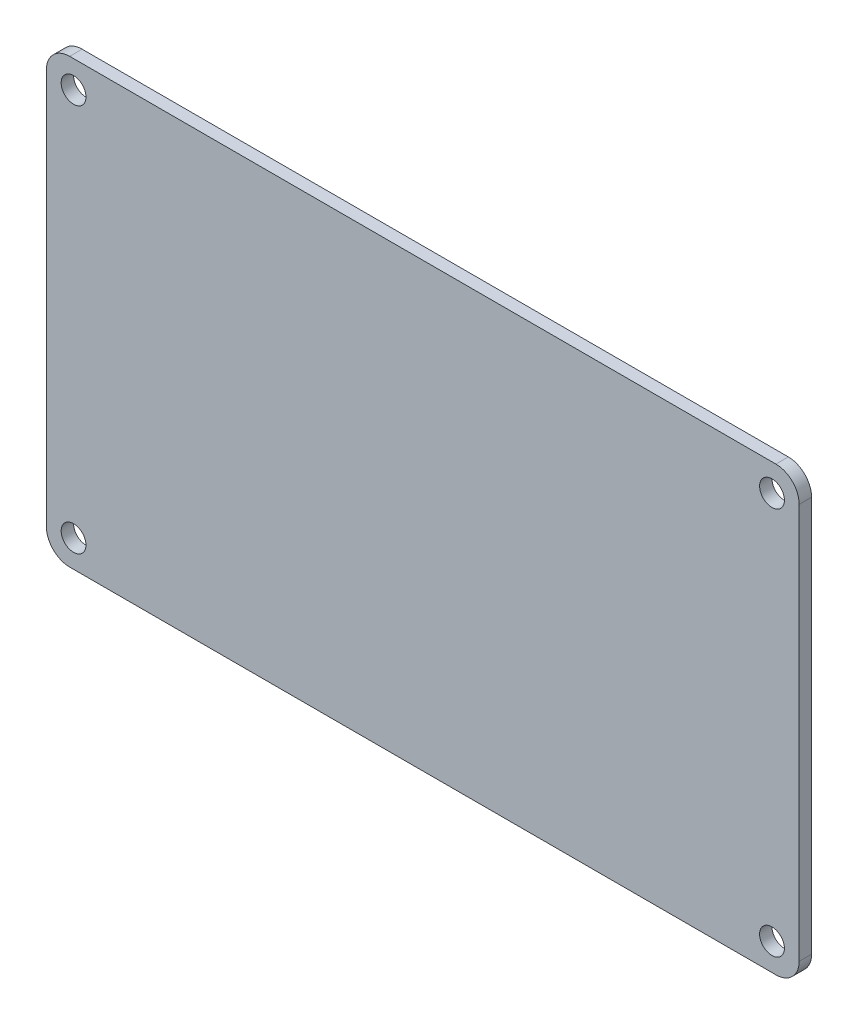
ISO-10303-21;
HEADER;
FILE_DESCRIPTION(('STEP AP214'),'2;1');
FILE_NAME('part.step','',(''),(''),'','','');
FILE_SCHEMA(('AUTOMOTIVE_DESIGN { 1 0 10303 214 1 1 1 1 }'));
ENDSEC;
DATA;
#1=APPLICATION_CONTEXT('core data for automotive mechanical design processes');
#2=APPLICATION_PROTOCOL_DEFINITION('international standard','automotive_design',2000,#1);
#3=PRODUCT_CONTEXT('',#1,'mechanical');
#4=PRODUCT('Part','Part','',(#3));
#5=PRODUCT_RELATED_PRODUCT_CATEGORY('part','',(#4));
#6=PRODUCT_DEFINITION_FORMATION('','',#4);
#7=PRODUCT_DEFINITION_CONTEXT('part definition',#1,'design');
#8=PRODUCT_DEFINITION('design','',#6,#7);
#9=PRODUCT_DEFINITION_SHAPE('','',#8);
#10=(LENGTH_UNIT() NAMED_UNIT(*) SI_UNIT(.MILLI.,.METRE.));
#11=(NAMED_UNIT(*) PLANE_ANGLE_UNIT() SI_UNIT($,.RADIAN.));
#12=(NAMED_UNIT(*) SI_UNIT($,.STERADIAN.) SOLID_ANGLE_UNIT());
#13=UNCERTAINTY_MEASURE_WITH_UNIT(LENGTH_MEASURE(1.E-05),#10,'distance_accuracy_value','');
#14=(GEOMETRIC_REPRESENTATION_CONTEXT(3) GLOBAL_UNCERTAINTY_ASSIGNED_CONTEXT((#13)) GLOBAL_UNIT_ASSIGNED_CONTEXT((#10,
#11,#12)) REPRESENTATION_CONTEXT('',''));
#15=CARTESIAN_POINT('',(0.,0.,0.));
#16=DIRECTION('',(0.,0.,1.));
#17=DIRECTION('',(1.,0.,0.));
#18=AXIS2_PLACEMENT_3D('',#15,#16,#17);
#19=CARTESIAN_POINT('',(103.268936351578,11.5679681605232,1.6));
#20=DIRECTION('',(0.,0.,1.));
#21=DIRECTION('',(1.,0.,0.));
#22=AXIS2_PLACEMENT_3D('',#19,#20,#21);
#23=PLANE('',#22);
#24=CARTESIAN_POINT('',(102.768936351578,62.0679681605232,1.6));
#25=DIRECTION('',(0.,0.,1.));
#26=DIRECTION('',(1.,0.,0.));
#27=AXIS2_PLACEMENT_3D('',#24,#25,#26);
#28=CIRCLE('',#27,1.60000000000001);
#29=CARTESIAN_POINT('',(104.368936351578,62.0679681605232,1.6));
#30=VERTEX_POINT('',#29);
#31=EDGE_CURVE('E188',#30,#30,#28,.T.);
#32=ORIENTED_EDGE('',*,*,#31,.F.);
#33=EDGE_LOOP('',(#32));
#34=FACE_BOUND('',#33,.T.);
#35=CARTESIAN_POINT('',(12.7689363515783,12.0679681605232,1.6));
#36=DIRECTION('',(0.,0.,1.));
#37=DIRECTION('',(1.,0.,0.));
#38=AXIS2_PLACEMENT_3D('',#35,#36,#37);
#39=CIRCLE('',#38,1.6);
#40=CARTESIAN_POINT('',(14.3689363515783,12.0679681605232,1.6));
#41=VERTEX_POINT('',#40);
#42=EDGE_CURVE('E134',#41,#41,#39,.T.);
#43=ORIENTED_EDGE('',*,*,#42,.F.);
#44=EDGE_LOOP('',(#43));
#45=FACE_BOUND('',#44,.T.);
#46=CARTESIAN_POINT('',(103.268936351578,11.5679681605232,1.6));
#47=DIRECTION('',(0.,0.,1.));
#48=DIRECTION('',(1.,0.,0.));
#49=AXIS2_PLACEMENT_3D('',#46,#47,#48);
#50=CIRCLE('',#49,3.);
#51=CARTESIAN_POINT('',(103.268936351578,8.56796816052323,1.6));
#52=VERTEX_POINT('',#51);
#53=CARTESIAN_POINT('',(106.268936351578,11.5679681605233,1.6));
#54=VERTEX_POINT('',#53);
#55=EDGE_CURVE('E145',#52,#54,#50,.T.);
#56=ORIENTED_EDGE('',*,*,#55,.T.);
#57=DIRECTION('',(0.,1.,0.));
#58=VECTOR('',#57,1.);
#59=CARTESIAN_POINT('',(106.268936351578,11.5679681605233,1.6));
#60=LINE('',#59,#58);
#61=CARTESIAN_POINT('',(106.268936351578,62.5679681605232,1.6));
#62=VERTEX_POINT('',#61);
#63=EDGE_CURVE('E93',#54,#62,#60,.T.);
#64=ORIENTED_EDGE('',*,*,#63,.T.);
#65=CARTESIAN_POINT('',(103.268936351578,62.5679681605232,1.6));
#66=DIRECTION('',(0.,0.,1.));
#67=DIRECTION('',(-1.,0.,0.));
#68=AXIS2_PLACEMENT_3D('',#65,#66,#67);
#69=CIRCLE('',#68,3.);
#70=CARTESIAN_POINT('',(103.268936351578,65.5679681605232,1.6));
#71=VERTEX_POINT('',#70);
#72=EDGE_CURVE('E160',#62,#71,#69,.T.);
#73=ORIENTED_EDGE('',*,*,#72,.T.);
#74=DIRECTION('',(-1.,0.,0.));
#75=VECTOR('',#74,1.);
#76=CARTESIAN_POINT('',(12.2689363515783,65.5679681605232,1.6));
#77=LINE('',#76,#75);
#78=CARTESIAN_POINT('',(12.2689363515783,65.5679681605232,1.6));
#79=VERTEX_POINT('',#78);
#80=EDGE_CURVE('E173',#71,#79,#77,.T.);
#81=ORIENTED_EDGE('',*,*,#80,.T.);
#82=CARTESIAN_POINT('',(12.2689363515783,62.5679681605232,1.6));
#83=DIRECTION('',(0.,0.,1.));
#84=DIRECTION('',(-1.,0.,0.));
#85=AXIS2_PLACEMENT_3D('',#82,#83,#84);
#86=CIRCLE('',#85,3.);
#87=CARTESIAN_POINT('',(9.26893635157831,62.5679681605232,1.6));
#88=VERTEX_POINT('',#87);
#89=EDGE_CURVE('E112',#79,#88,#86,.T.);
#90=ORIENTED_EDGE('',*,*,#89,.T.);
#91=DIRECTION('',(0.,-1.,0.));
#92=VECTOR('',#91,1.);
#93=CARTESIAN_POINT('',(9.26893635157831,11.5679681605233,1.6));
#94=LINE('',#93,#92);
#95=CARTESIAN_POINT('',(9.26893635157831,11.5679681605233,1.6));
#96=VERTEX_POINT('',#95);
#97=EDGE_CURVE('E106',#88,#96,#94,.T.);
#98=ORIENTED_EDGE('',*,*,#97,.T.);
#99=CARTESIAN_POINT('',(12.2689363515783,11.5679681605232,1.6));
#100=DIRECTION('',(0.,0.,1.));
#101=DIRECTION('',(-1.,0.,0.));
#102=AXIS2_PLACEMENT_3D('',#99,#100,#101);
#103=CIRCLE('',#102,3.);
#104=CARTESIAN_POINT('',(12.2689363515783,8.56796816052323,1.6));
#105=VERTEX_POINT('',#104);
#106=EDGE_CURVE('E110',#96,#105,#103,.T.);
#107=ORIENTED_EDGE('',*,*,#106,.T.);
#108=DIRECTION('',(1.,0.,0.));
#109=VECTOR('',#108,1.);
#110=CARTESIAN_POINT('',(12.2689363515783,8.56796816052323,1.6));
#111=LINE('',#110,#109);
#112=EDGE_CURVE('E50',#105,#52,#111,.T.);
#113=ORIENTED_EDGE('',*,*,#112,.T.);
#114=EDGE_LOOP('',(#56,#64,#73,#81,#90,#98,#107,#113));
#115=FACE_BOUND('',#114,.T.);
#116=CARTESIAN_POINT('',(12.7689363515783,62.0679681605232,1.6));
#117=DIRECTION('',(0.,0.,1.));
#118=DIRECTION('',(1.,0.,0.));
#119=AXIS2_PLACEMENT_3D('',#116,#117,#118);
#120=CIRCLE('',#119,1.6);
#121=CARTESIAN_POINT('',(14.3689363515783,62.0679681605232,1.6));
#122=VERTEX_POINT('',#121);
#123=EDGE_CURVE('E182',#122,#122,#120,.T.);
#124=ORIENTED_EDGE('',*,*,#123,.F.);
#125=EDGE_LOOP('',(#124));
#126=FACE_BOUND('',#125,.T.);
#127=CARTESIAN_POINT('',(102.768936351578,12.0679681605232,1.6));
#128=DIRECTION('',(0.,0.,1.));
#129=DIRECTION('',(1.,0.,0.));
#130=AXIS2_PLACEMENT_3D('',#127,#128,#129);
#131=CIRCLE('',#130,1.6);
#132=CARTESIAN_POINT('',(104.368936351578,12.0679681605232,1.6));
#133=VERTEX_POINT('',#132);
#134=EDGE_CURVE('E194',#133,#133,#131,.T.);
#135=ORIENTED_EDGE('',*,*,#134,.F.);
#136=EDGE_LOOP('',(#135));
#137=FACE_BOUND('',#136,.T.);
#138=ADVANCED_FACE('F33',(#34,#45,#115,#126,#137),#23,.T.);
#139=CARTESIAN_POINT('',(103.268936351578,11.5679681605232,0.));
#140=DIRECTION('',(0.,0.,1.));
#141=DIRECTION('',(1.,0.,0.));
#142=AXIS2_PLACEMENT_3D('',#139,#140,#141);
#143=PLANE('',#142);
#144=CARTESIAN_POINT('',(102.768936351578,62.0679681605232,0.));
#145=DIRECTION('',(0.,0.,1.));
#146=DIRECTION('',(1.,0.,0.));
#147=AXIS2_PLACEMENT_3D('',#144,#145,#146);
#148=CIRCLE('',#147,1.60000000000001);
#149=CARTESIAN_POINT('',(104.368936351578,62.0679681605232,0.));
#150=VERTEX_POINT('',#149);
#151=EDGE_CURVE('E191',#150,#150,#148,.T.);
#152=ORIENTED_EDGE('',*,*,#151,.T.);
#153=EDGE_LOOP('',(#152));
#154=FACE_BOUND('',#153,.T.);
#155=CARTESIAN_POINT('',(12.7689363515783,12.0679681605232,0.));
#156=DIRECTION('',(0.,0.,1.));
#157=DIRECTION('',(1.,0.,0.));
#158=AXIS2_PLACEMENT_3D('',#155,#156,#157);
#159=CIRCLE('',#158,1.6);
#160=CARTESIAN_POINT('',(14.3689363515783,12.0679681605232,0.));
#161=VERTEX_POINT('',#160);
#162=EDGE_CURVE('E179',#161,#161,#159,.T.);
#163=ORIENTED_EDGE('',*,*,#162,.T.);
#164=EDGE_LOOP('',(#163));
#165=FACE_BOUND('',#164,.T.);
#166=CARTESIAN_POINT('',(103.268936351578,11.5679681605232,0.));
#167=DIRECTION('',(0.,0.,1.));
#168=DIRECTION('',(1.,0.,0.));
#169=AXIS2_PLACEMENT_3D('',#166,#167,#168);
#170=CIRCLE('',#169,3.);
#171=CARTESIAN_POINT('',(103.268936351578,8.56796816052323,0.));
#172=VERTEX_POINT('',#171);
#173=CARTESIAN_POINT('',(106.268936351578,11.5679681605233,0.));
#174=VERTEX_POINT('',#173);
#175=EDGE_CURVE('E130',#172,#174,#170,.T.);
#176=ORIENTED_EDGE('',*,*,#175,.F.);
#177=DIRECTION('',(1.,0.,0.));
#178=VECTOR('',#177,1.);
#179=CARTESIAN_POINT('',(12.2689363515783,8.56796816052323,0.));
#180=LINE('',#179,#178);
#181=CARTESIAN_POINT('',(12.2689363515783,8.56796816052323,0.));
#182=VERTEX_POINT('',#181);
#183=EDGE_CURVE('E85',#182,#172,#180,.T.);
#184=ORIENTED_EDGE('',*,*,#183,.F.);
#185=CARTESIAN_POINT('',(12.2689363515783,11.5679681605232,0.));
#186=DIRECTION('',(0.,0.,1.));
#187=DIRECTION('',(-1.,0.,0.));
#188=AXIS2_PLACEMENT_3D('',#185,#186,#187);
#189=CIRCLE('',#188,3.);
#190=CARTESIAN_POINT('',(9.26893635157831,11.5679681605233,0.));
#191=VERTEX_POINT('',#190);
#192=EDGE_CURVE('E79',#191,#182,#189,.T.);
#193=ORIENTED_EDGE('',*,*,#192,.F.);
#194=DIRECTION('',(0.,-1.,0.));
#195=VECTOR('',#194,1.);
#196=CARTESIAN_POINT('',(9.26893635157831,11.5679681605233,0.));
#197=LINE('',#196,#195);
#198=CARTESIAN_POINT('',(9.26893635157831,62.5679681605232,0.));
#199=VERTEX_POINT('',#198);
#200=EDGE_CURVE('E120',#199,#191,#197,.T.);
#201=ORIENTED_EDGE('',*,*,#200,.F.);
#202=CARTESIAN_POINT('',(12.2689363515783,62.5679681605232,0.));
#203=DIRECTION('',(0.,0.,1.));
#204=DIRECTION('',(-1.,0.,0.));
#205=AXIS2_PLACEMENT_3D('',#202,#203,#204);
#206=CIRCLE('',#205,3.);
#207=CARTESIAN_POINT('',(12.2689363515783,65.5679681605232,0.));
#208=VERTEX_POINT('',#207);
#209=EDGE_CURVE('E140',#208,#199,#206,.T.);
#210=ORIENTED_EDGE('',*,*,#209,.F.);
#211=DIRECTION('',(-1.,0.,0.));
#212=VECTOR('',#211,1.);
#213=CARTESIAN_POINT('',(12.2689363515783,65.5679681605232,0.));
#214=LINE('',#213,#212);
#215=CARTESIAN_POINT('',(103.268936351578,65.5679681605232,0.));
#216=VERTEX_POINT('',#215);
#217=EDGE_CURVE('E138',#216,#208,#214,.T.);
#218=ORIENTED_EDGE('',*,*,#217,.F.);
#219=CARTESIAN_POINT('',(103.268936351578,62.5679681605232,0.));
#220=DIRECTION('',(0.,0.,1.));
#221=DIRECTION('',(-1.,0.,0.));
#222=AXIS2_PLACEMENT_3D('',#219,#220,#221);
#223=CIRCLE('',#222,3.);
#224=CARTESIAN_POINT('',(106.268936351578,62.5679681605232,0.));
#225=VERTEX_POINT('',#224);
#226=EDGE_CURVE('E136',#225,#216,#223,.T.);
#227=ORIENTED_EDGE('',*,*,#226,.F.);
#228=DIRECTION('',(0.,1.,0.));
#229=VECTOR('',#228,1.);
#230=CARTESIAN_POINT('',(106.268936351578,11.5679681605233,0.));
#231=LINE('',#230,#229);
#232=EDGE_CURVE('E133',#174,#225,#231,.T.);
#233=ORIENTED_EDGE('',*,*,#232,.F.);
#234=EDGE_LOOP('',(#176,#184,#193,#201,#210,#218,#227,#233));
#235=FACE_BOUND('',#234,.T.);
#236=CARTESIAN_POINT('',(12.7689363515783,62.0679681605232,0.));
#237=DIRECTION('',(0.,0.,1.));
#238=DIRECTION('',(1.,0.,0.));
#239=AXIS2_PLACEMENT_3D('',#236,#237,#238);
#240=CIRCLE('',#239,1.6);
#241=CARTESIAN_POINT('',(14.3689363515783,62.0679681605232,0.));
#242=VERTEX_POINT('',#241);
#243=EDGE_CURVE('E185',#242,#242,#240,.T.);
#244=ORIENTED_EDGE('',*,*,#243,.T.);
#245=EDGE_LOOP('',(#244));
#246=FACE_BOUND('',#245,.T.);
#247=CARTESIAN_POINT('',(102.768936351578,12.0679681605232,0.));
#248=DIRECTION('',(0.,0.,1.));
#249=DIRECTION('',(1.,0.,0.));
#250=AXIS2_PLACEMENT_3D('',#247,#248,#249);
#251=CIRCLE('',#250,1.6);
#252=CARTESIAN_POINT('',(104.368936351578,12.0679681605232,0.));
#253=VERTEX_POINT('',#252);
#254=EDGE_CURVE('E197',#253,#253,#251,.T.);
#255=ORIENTED_EDGE('',*,*,#254,.T.);
#256=EDGE_LOOP('',(#255));
#257=FACE_BOUND('',#256,.T.);
#258=ADVANCED_FACE('F164',(#154,#165,#235,#246,#257),#143,.F.);
#259=CARTESIAN_POINT('',(103.268936351578,11.5679681605232,1.6));
#260=DIRECTION('',(0.,0.,-1.));
#261=DIRECTION('',(-1.,0.,0.));
#262=AXIS2_PLACEMENT_3D('',#259,#260,#261);
#263=CYLINDRICAL_SURFACE('',#262,3.);
#264=ORIENTED_EDGE('',*,*,#175,.T.);
#265=DIRECTION('',(0.,0.,-1.));
#266=VECTOR('',#265,1.);
#267=CARTESIAN_POINT('',(106.268936351578,11.5679681605233,1.6));
#268=LINE('',#267,#266);
#269=EDGE_CURVE('E11',#54,#174,#268,.T.);
#270=ORIENTED_EDGE('',*,*,#269,.F.);
#271=ORIENTED_EDGE('',*,*,#55,.F.);
#272=DIRECTION('',(0.,0.,-1.));
#273=VECTOR('',#272,1.);
#274=CARTESIAN_POINT('',(103.268936351578,8.56796816052323,1.6));
#275=LINE('',#274,#273);
#276=EDGE_CURVE('E126',#52,#172,#275,.T.);
#277=ORIENTED_EDGE('',*,*,#276,.T.);
#278=EDGE_LOOP('',(#264,#270,#271,#277));
#279=FACE_BOUND('',#278,.T.);
#280=ADVANCED_FACE('F35',(#279),#263,.T.);
#281=CARTESIAN_POINT('',(106.268936351578,11.5679681605233,1.6));
#282=DIRECTION('',(-1.,0.,0.));
#283=DIRECTION('',(0.,0.,1.));
#284=AXIS2_PLACEMENT_3D('',#281,#282,#283);
#285=PLANE('',#284);
#286=ORIENTED_EDGE('',*,*,#232,.T.);
#287=DIRECTION('',(0.,0.,-1.));
#288=VECTOR('',#287,1.);
#289=CARTESIAN_POINT('',(106.268936351578,62.5679681605232,1.6));
#290=LINE('',#289,#288);
#291=EDGE_CURVE('E42',#62,#225,#290,.T.);
#292=ORIENTED_EDGE('',*,*,#291,.F.);
#293=ORIENTED_EDGE('',*,*,#63,.F.);
#294=ORIENTED_EDGE('',*,*,#269,.T.);
#295=EDGE_LOOP('',(#286,#292,#293,#294));
#296=FACE_BOUND('',#295,.T.);
#297=ADVANCED_FACE('F232',(#296),#285,.F.);
#298=CARTESIAN_POINT('',(103.268936351578,62.5679681605232,1.6));
#299=DIRECTION('',(0.,0.,-1.));
#300=DIRECTION('',(-1.,0.,0.));
#301=AXIS2_PLACEMENT_3D('',#298,#299,#300);
#302=CYLINDRICAL_SURFACE('',#301,3.);
#303=ORIENTED_EDGE('',*,*,#226,.T.);
#304=DIRECTION('',(0.,0.,-1.));
#305=VECTOR('',#304,1.);
#306=CARTESIAN_POINT('',(103.268936351578,65.5679681605232,1.6));
#307=LINE('',#306,#305);
#308=EDGE_CURVE('E152',#71,#216,#307,.T.);
#309=ORIENTED_EDGE('',*,*,#308,.F.);
#310=ORIENTED_EDGE('',*,*,#72,.F.);
#311=ORIENTED_EDGE('',*,*,#291,.T.);
#312=EDGE_LOOP('',(#303,#309,#310,#311));
#313=FACE_BOUND('',#312,.T.);
#314=ADVANCED_FACE('F158',(#313),#302,.T.);
#315=CARTESIAN_POINT('',(12.2689363515783,65.5679681605232,1.6));
#316=DIRECTION('',(0.,-1.,0.));
#317=DIRECTION('',(0.,0.,-1.));
#318=AXIS2_PLACEMENT_3D('',#315,#316,#317);
#319=PLANE('',#318);
#320=ORIENTED_EDGE('',*,*,#217,.T.);
#321=DIRECTION('',(0.,0.,-1.));
#322=VECTOR('',#321,1.);
#323=CARTESIAN_POINT('',(12.2689363515783,65.5679681605232,1.6));
#324=LINE('',#323,#322);
#325=EDGE_CURVE('E149',#79,#208,#324,.T.);
#326=ORIENTED_EDGE('',*,*,#325,.F.);
#327=ORIENTED_EDGE('',*,*,#80,.F.);
#328=ORIENTED_EDGE('',*,*,#308,.T.);
#329=EDGE_LOOP('',(#320,#326,#327,#328));
#330=FACE_BOUND('',#329,.T.);
#331=ADVANCED_FACE('F169',(#330),#319,.F.);
#332=CARTESIAN_POINT('',(12.2689363515783,62.5679681605232,1.6));
#333=DIRECTION('',(0.,0.,-1.));
#334=DIRECTION('',(-1.,0.,0.));
#335=AXIS2_PLACEMENT_3D('',#332,#333,#334);
#336=CYLINDRICAL_SURFACE('',#335,3.);
#337=ORIENTED_EDGE('',*,*,#209,.T.);
#338=DIRECTION('',(0.,0.,-1.));
#339=VECTOR('',#338,1.);
#340=CARTESIAN_POINT('',(9.26893635157831,62.5679681605232,1.6));
#341=LINE('',#340,#339);
#342=EDGE_CURVE('E121',#88,#199,#341,.T.);
#343=ORIENTED_EDGE('',*,*,#342,.F.);
#344=ORIENTED_EDGE('',*,*,#89,.F.);
#345=ORIENTED_EDGE('',*,*,#325,.T.);
#346=EDGE_LOOP('',(#337,#343,#344,#345));
#347=FACE_BOUND('',#346,.T.);
#348=ADVANCED_FACE('F172',(#347),#336,.T.);
#349=CARTESIAN_POINT('',(9.26893635157831,11.5679681605233,1.6));
#350=DIRECTION('',(1.,0.,0.));
#351=DIRECTION('',(0.,0.,-1.));
#352=AXIS2_PLACEMENT_3D('',#349,#350,#351);
#353=PLANE('',#352);
#354=ORIENTED_EDGE('',*,*,#200,.T.);
#355=DIRECTION('',(0.,0.,-1.));
#356=VECTOR('',#355,1.);
#357=CARTESIAN_POINT('',(9.26893635157831,11.5679681605233,1.6));
#358=LINE('',#357,#356);
#359=EDGE_CURVE('E117',#96,#191,#358,.T.);
#360=ORIENTED_EDGE('',*,*,#359,.F.);
#361=ORIENTED_EDGE('',*,*,#97,.F.);
#362=ORIENTED_EDGE('',*,*,#342,.T.);
#363=EDGE_LOOP('',(#354,#360,#361,#362));
#364=FACE_BOUND('',#363,.T.);
#365=ADVANCED_FACE('F118',(#364),#353,.F.);
#366=CARTESIAN_POINT('',(12.2689363515783,11.5679681605232,1.6));
#367=DIRECTION('',(0.,0.,-1.));
#368=DIRECTION('',(-1.,0.,0.));
#369=AXIS2_PLACEMENT_3D('',#366,#367,#368);
#370=CYLINDRICAL_SURFACE('',#369,3.);
#371=ORIENTED_EDGE('',*,*,#192,.T.);
#372=DIRECTION('',(0.,0.,-1.));
#373=VECTOR('',#372,1.);
#374=CARTESIAN_POINT('',(12.2689363515783,8.56796816052323,1.6));
#375=LINE('',#374,#373);
#376=EDGE_CURVE('E122',#105,#182,#375,.T.);
#377=ORIENTED_EDGE('',*,*,#376,.F.);
#378=ORIENTED_EDGE('',*,*,#106,.F.);
#379=ORIENTED_EDGE('',*,*,#359,.T.);
#380=EDGE_LOOP('',(#371,#377,#378,#379));
#381=FACE_BOUND('',#380,.T.);
#382=ADVANCED_FACE('F124',(#381),#370,.T.);
#383=CARTESIAN_POINT('',(12.2689363515783,8.56796816052323,1.6));
#384=DIRECTION('',(0.,1.,0.));
#385=DIRECTION('',(0.,0.,1.));
#386=AXIS2_PLACEMENT_3D('',#383,#384,#385);
#387=PLANE('',#386);
#388=ORIENTED_EDGE('',*,*,#183,.T.);
#389=ORIENTED_EDGE('',*,*,#276,.F.);
#390=ORIENTED_EDGE('',*,*,#112,.F.);
#391=ORIENTED_EDGE('',*,*,#376,.T.);
#392=EDGE_LOOP('',(#388,#389,#390,#391));
#393=FACE_BOUND('',#392,.T.);
#394=ADVANCED_FACE('F220',(#393),#387,.F.);
#395=CARTESIAN_POINT('',(12.7689363515783,12.0679681605232,1.6));
#396=DIRECTION('',(0.,0.,-1.));
#397=DIRECTION('',(-1.,0.,0.));
#398=AXIS2_PLACEMENT_3D('',#395,#396,#397);
#399=CYLINDRICAL_SURFACE('',#398,1.6);
#400=ORIENTED_EDGE('',*,*,#42,.T.);
#401=EDGE_LOOP('',(#400));
#402=FACE_BOUND('',#401,.T.);
#403=ORIENTED_EDGE('',*,*,#162,.F.);
#404=EDGE_LOOP('',(#403));
#405=FACE_BOUND('',#404,.T.);
#406=ADVANCED_FACE('F217',(#402,#405),#399,.F.);
#407=CARTESIAN_POINT('',(12.7689363515783,62.0679681605232,1.6));
#408=DIRECTION('',(0.,0.,-1.));
#409=DIRECTION('',(-1.,0.,0.));
#410=AXIS2_PLACEMENT_3D('',#407,#408,#409);
#411=CYLINDRICAL_SURFACE('',#410,1.6);
#412=ORIENTED_EDGE('',*,*,#123,.T.);
#413=EDGE_LOOP('',(#412));
#414=FACE_BOUND('',#413,.T.);
#415=ORIENTED_EDGE('',*,*,#243,.F.);
#416=EDGE_LOOP('',(#415));
#417=FACE_BOUND('',#416,.T.);
#418=ADVANCED_FACE('F296',(#414,#417),#411,.F.);
#419=CARTESIAN_POINT('',(102.768936351578,62.0679681605232,1.6));
#420=DIRECTION('',(0.,0.,-1.));
#421=DIRECTION('',(-1.,0.,0.));
#422=AXIS2_PLACEMENT_3D('',#419,#420,#421);
#423=CYLINDRICAL_SURFACE('',#422,1.60000000000001);
#424=ORIENTED_EDGE('',*,*,#31,.T.);
#425=EDGE_LOOP('',(#424));
#426=FACE_BOUND('',#425,.T.);
#427=ORIENTED_EDGE('',*,*,#151,.F.);
#428=EDGE_LOOP('',(#427));
#429=FACE_BOUND('',#428,.T.);
#430=ADVANCED_FACE('F304',(#426,#429),#423,.F.);
#431=CARTESIAN_POINT('',(102.768936351578,12.0679681605232,1.6));
#432=DIRECTION('',(0.,0.,-1.));
#433=DIRECTION('',(-1.,0.,0.));
#434=AXIS2_PLACEMENT_3D('',#431,#432,#433);
#435=CYLINDRICAL_SURFACE('',#434,1.6);
#436=ORIENTED_EDGE('',*,*,#134,.T.);
#437=EDGE_LOOP('',(#436));
#438=FACE_BOUND('',#437,.T.);
#439=ORIENTED_EDGE('',*,*,#254,.F.);
#440=EDGE_LOOP('',(#439));
#441=FACE_BOUND('',#440,.T.);
#442=ADVANCED_FACE('F203',(#438,#441),#435,.F.);
#443=CLOSED_SHELL('',(#138,#258,#280,#297,#314,#331,#348,#365,#382,#394,#406,#418,#430,#442));
#444=MANIFOLD_SOLID_BREP('B2',#443);
#445=ADVANCED_BREP_SHAPE_REPRESENTATION('',(#18,#444),#14);
#446=SHAPE_DEFINITION_REPRESENTATION(#9,#445);
ENDSEC;
END-ISO-10303-21;
